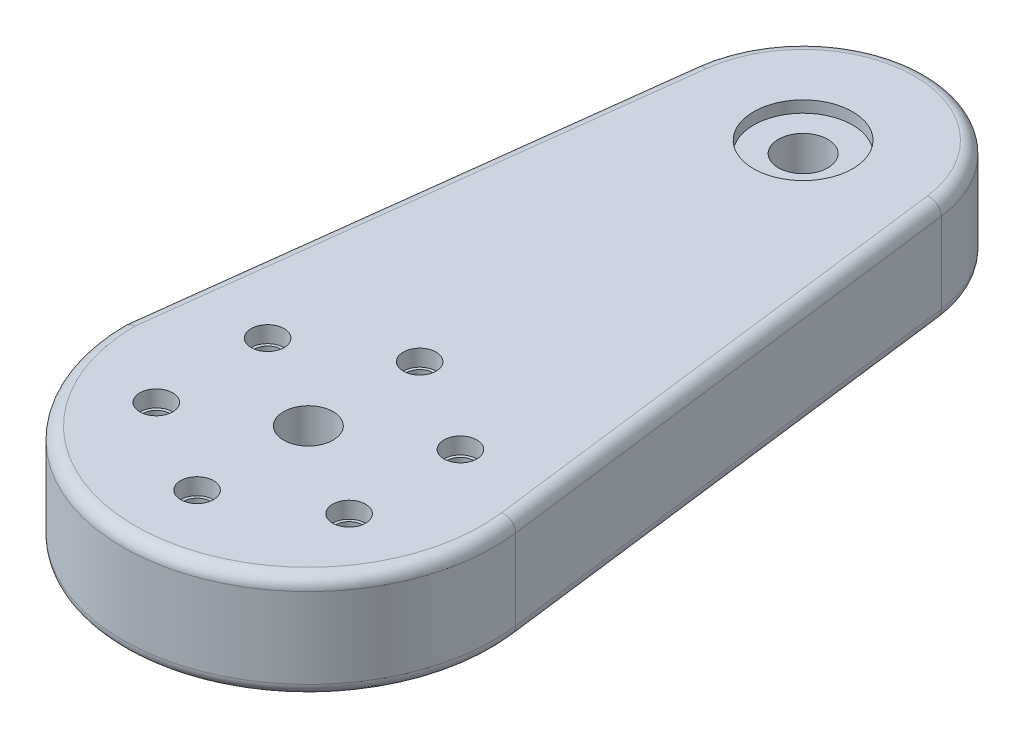
ISO-10303-21;
HEADER;
FILE_DESCRIPTION(('STEP AP214'),'2;1');
FILE_NAME('part.step','',(''),(''),'','','');
FILE_SCHEMA(('AUTOMOTIVE_DESIGN { 1 0 10303 214 1 1 1 1 }'));
ENDSEC;
DATA;
#1=APPLICATION_CONTEXT('core data for automotive mechanical design processes');
#2=APPLICATION_PROTOCOL_DEFINITION('international standard','automotive_design',2000,#1);
#3=PRODUCT_CONTEXT('',#1,'mechanical');
#4=PRODUCT('Part','Part','',(#3));
#5=PRODUCT_RELATED_PRODUCT_CATEGORY('part','',(#4));
#6=PRODUCT_DEFINITION_FORMATION('','',#4);
#7=PRODUCT_DEFINITION_CONTEXT('part definition',#1,'design');
#8=PRODUCT_DEFINITION('design','',#6,#7);
#9=PRODUCT_DEFINITION_SHAPE('','',#8);
#10=(LENGTH_UNIT() NAMED_UNIT(*) SI_UNIT(.MILLI.,.METRE.));
#11=(NAMED_UNIT(*) PLANE_ANGLE_UNIT() SI_UNIT($,.RADIAN.));
#12=(NAMED_UNIT(*) SI_UNIT($,.STERADIAN.) SOLID_ANGLE_UNIT());
#13=UNCERTAINTY_MEASURE_WITH_UNIT(LENGTH_MEASURE(1.E-05),#10,'distance_accuracy_value','');
#14=(GEOMETRIC_REPRESENTATION_CONTEXT(3) GLOBAL_UNCERTAINTY_ASSIGNED_CONTEXT((#13)) GLOBAL_UNIT_ASSIGNED_CONTEXT((#10,
#11,#12)) REPRESENTATION_CONTEXT('',''));
#15=CARTESIAN_POINT('',(0.,0.,0.));
#16=DIRECTION('',(0.,0.,1.));
#17=DIRECTION('',(1.,0.,0.));
#18=AXIS2_PLACEMENT_3D('',#15,#16,#17);
#19=CARTESIAN_POINT('',(-0.0107904248628195,-6.45952704580595,-52.1484733966002));
#20=DIRECTION('',(0.,1.,0.));
#21=DIRECTION('',(0.,0.,1.));
#22=AXIS2_PLACEMENT_3D('',#19,#20,#21);
#23=CYLINDRICAL_SURFACE('',#22,3.);
#24=CARTESIAN_POINT('',(-0.0107904248628195,-6.37500172561487,-52.1484733966002));
#25=DIRECTION('',(0.,1.,0.));
#26=DIRECTION('',(0.,0.,1.));
#27=AXIS2_PLACEMENT_3D('',#24,#25,#26);
#28=CIRCLE('',#27,3.);
#29=CARTESIAN_POINT('',(-0.0107904248628195,-6.37500172561487,-49.1484733966002));
#30=VERTEX_POINT('',#29);
#31=EDGE_CURVE('E151',#30,#30,#28,.T.);
#32=ORIENTED_EDGE('',*,*,#31,.F.);
#33=EDGE_LOOP('',(#32));
#34=FACE_BOUND('',#33,.T.);
#35=CARTESIAN_POINT('',(-0.0107904248628195,4.97499827438514,-52.1484733966002));
#36=DIRECTION('',(0.,1.,0.));
#37=DIRECTION('',(0.,0.,1.));
#38=AXIS2_PLACEMENT_3D('',#35,#36,#37);
#39=CIRCLE('',#38,3.);
#40=CARTESIAN_POINT('',(-0.0107904248628195,4.97499827438514,-49.1484733966002));
#41=VERTEX_POINT('',#40);
#42=EDGE_CURVE('E52',#41,#41,#39,.F.);
#43=ORIENTED_EDGE('',*,*,#42,.F.);
#44=EDGE_LOOP('',(#43));
#45=FACE_BOUND('',#44,.T.);
#46=ADVANCED_FACE('F48',(#34,#45),#23,.F.);
#47=CARTESIAN_POINT('',(22.3127362622447,6.37499827438514,5.03902660339984));
#48=DIRECTION('',(0.992156741649222,0.,-0.125));
#49=DIRECTION('',(-0.125,0.,-0.992156741649222));
#50=AXIS2_PLACEMENT_3D('',#47,#48,#49);
#51=PLANE('',#50);
#52=DIRECTION('',(0.,-1.,0.));
#53=VECTOR('',#52,1.);
#54=CARTESIAN_POINT('',(22.3127362622447,6.37499827438514,5.03902660339983));
#55=LINE('',#54,#53);
#56=CARTESIAN_POINT('',(22.3127362622447,4.87499827438514,5.03902660339983));
#57=VERTEX_POINT('',#56);
#58=CARTESIAN_POINT('',(22.3127362622447,-4.87500172561487,5.03902660339983));
#59=VERTEX_POINT('',#58);
#60=EDGE_CURVE('E142',#57,#59,#55,.T.);
#61=ORIENTED_EDGE('',*,*,#60,.T.);
#62=DIRECTION('',(0.125,0.,0.992156741649222));
#63=VECTOR('',#62,1.);
#64=CARTESIAN_POINT('',(14.8715606998755,-4.87500172561487,-54.0234733966002));
#65=LINE('',#64,#63);
#66=CARTESIAN_POINT('',(14.8715606998755,-4.87500172561487,-54.0234733966002));
#67=VERTEX_POINT('',#66);
#68=EDGE_CURVE('E12',#59,#67,#65,.F.);
#69=ORIENTED_EDGE('',*,*,#68,.T.);
#70=DIRECTION('',(0.,-1.,0.));
#71=VECTOR('',#70,1.);
#72=CARTESIAN_POINT('',(14.8715606998755,6.37499827438514,-54.0234733966002));
#73=LINE('',#72,#71);
#74=CARTESIAN_POINT('',(14.8715606998755,4.87499827438514,-54.0234733966002));
#75=VERTEX_POINT('',#74);
#76=EDGE_CURVE('E136',#75,#67,#73,.T.);
#77=ORIENTED_EDGE('',*,*,#76,.F.);
#78=DIRECTION('',(0.125,0.,0.992156741649222));
#79=VECTOR('',#78,1.);
#80=CARTESIAN_POINT('',(22.3127362622447,4.87499827438514,5.03902660339984));
#81=LINE('',#80,#79);
#82=EDGE_CURVE('E57',#75,#57,#81,.T.);
#83=ORIENTED_EDGE('',*,*,#82,.T.);
#84=EDGE_LOOP('',(#61,#69,#77,#83));
#85=FACE_BOUND('',#84,.T.);
#86=ADVANCED_FACE('F178',(#85),#51,.T.);
#87=CARTESIAN_POINT('',(-0.0107904248628195,6.37499827438514,-52.1484733966002));
#88=DIRECTION('',(0.,-1.,0.));
#89=DIRECTION('',(0.,0.,-1.));
#90=AXIS2_PLACEMENT_3D('',#87,#88,#89);
#91=CYLINDRICAL_SURFACE('',#90,15.);
#92=DIRECTION('',(0.,-1.,0.));
#93=VECTOR('',#92,1.);
#94=CARTESIAN_POINT('',(-14.8983912954131,6.37499827438514,-53.9813237230565));
#95=LINE('',#94,#93);
#96=CARTESIAN_POINT('',(-14.8983912954131,4.87499827438514,-53.9813237230565));
#97=VERTEX_POINT('',#96);
#98=CARTESIAN_POINT('',(-14.8983912954131,-4.87500172561487,-53.9813237230565));
#99=VERTEX_POINT('',#98);
#100=EDGE_CURVE('E249',#97,#99,#95,.T.);
#101=ORIENTED_EDGE('',*,*,#100,.F.);
#102=CARTESIAN_POINT('',(-0.0107904248628195,4.87499827438514,-52.1484733966002));
#103=DIRECTION('',(0.,1.,0.));
#104=DIRECTION('',(0.,0.,1.));
#105=AXIS2_PLACEMENT_3D('',#102,#103,#104);
#106=CIRCLE('',#105,15.);
#107=EDGE_CURVE('E236',#97,#75,#106,.F.);
#108=ORIENTED_EDGE('',*,*,#107,.T.);
#109=ORIENTED_EDGE('',*,*,#76,.T.);
#110=CARTESIAN_POINT('',(-0.0107904248628195,-4.87500172561487,-52.1484733966002));
#111=DIRECTION('',(0.,1.,0.));
#112=DIRECTION('',(0.,0.,1.));
#113=AXIS2_PLACEMENT_3D('',#110,#111,#112);
#114=CIRCLE('',#113,15.);
#115=EDGE_CURVE('E238',#67,#99,#114,.T.);
#116=ORIENTED_EDGE('',*,*,#115,.T.);
#117=EDGE_LOOP('',(#101,#108,#109,#116));
#118=FACE_BOUND('',#117,.T.);
#119=ADVANCED_FACE('F186',(#118),#91,.T.);
#120=CARTESIAN_POINT('',(-22.1748563929437,6.37499827438514,5.12285219182585));
#121=DIRECTION('',(0.992506724703351,0.,0.122190021763756));
#122=DIRECTION('',(0.122190021763756,0.,-0.992506724703351));
#123=AXIS2_PLACEMENT_3D('',#120,#121,#122);
#124=PLANE('',#123);
#125=DIRECTION('',(0.,-1.,0.));
#126=VECTOR('',#125,1.);
#127=CARTESIAN_POINT('',(-22.5107904248628,6.37499827438514,7.85152660339983));
#128=LINE('',#127,#126);
#129=CARTESIAN_POINT('',(-22.5107904248628,4.87499827438514,7.85152660339983));
#130=VERTEX_POINT('',#129);
#131=CARTESIAN_POINT('',(-22.5107904248628,-4.87500172561487,7.85152660339983));
#132=VERTEX_POINT('',#131);
#133=EDGE_CURVE('E252',#130,#132,#128,.T.);
#134=ORIENTED_EDGE('',*,*,#133,.F.);
#135=DIRECTION('',(-0.122190021763756,0.,0.992506724703351));
#136=VECTOR('',#135,1.);
#137=CARTESIAN_POINT('',(-14.8983912954131,4.87499827438514,-53.9813237230565));
#138=LINE('',#137,#136);
#139=EDGE_CURVE('E240',#130,#97,#138,.F.);
#140=ORIENTED_EDGE('',*,*,#139,.T.);
#141=ORIENTED_EDGE('',*,*,#100,.T.);
#142=DIRECTION('',(-0.122190021763756,0.,0.992506724703351));
#143=VECTOR('',#142,1.);
#144=CARTESIAN_POINT('',(-22.1748563929437,-4.87500172561487,5.12285219182585));
#145=LINE('',#144,#143);
#146=EDGE_CURVE('E243',#99,#132,#145,.T.);
#147=ORIENTED_EDGE('',*,*,#146,.T.);
#148=EDGE_LOOP('',(#134,#140,#141,#147));
#149=FACE_BOUND('',#148,.T.);
#150=ADVANCED_FACE('F204',(#149),#124,.F.);
#151=CARTESIAN_POINT('',(-0.0107904248628195,6.37499827438514,7.85152660339983));
#152=DIRECTION('',(0.,-1.,0.));
#153=DIRECTION('',(0.,0.,-1.));
#154=AXIS2_PLACEMENT_3D('',#151,#152,#153);
#155=CYLINDRICAL_SURFACE('',#154,22.5);
#156=ORIENTED_EDGE('',*,*,#60,.F.);
#157=CARTESIAN_POINT('',(-0.0107904248628195,4.87499827438514,7.85152660339983));
#158=DIRECTION('',(0.,1.,0.));
#159=DIRECTION('',(0.,0.,1.));
#160=AXIS2_PLACEMENT_3D('',#157,#158,#159);
#161=CIRCLE('',#160,22.5);
#162=EDGE_CURVE('E139',#57,#130,#161,.F.);
#163=ORIENTED_EDGE('',*,*,#162,.T.);
#164=ORIENTED_EDGE('',*,*,#133,.T.);
#165=CARTESIAN_POINT('',(-0.0107904248628195,-4.87500172561487,7.85152660339983));
#166=DIRECTION('',(0.,1.,0.));
#167=DIRECTION('',(0.,0.,1.));
#168=AXIS2_PLACEMENT_3D('',#165,#166,#167);
#169=CIRCLE('',#168,22.5);
#170=EDGE_CURVE('E233',#132,#59,#169,.T.);
#171=ORIENTED_EDGE('',*,*,#170,.T.);
#172=EDGE_LOOP('',(#156,#163,#164,#171));
#173=FACE_BOUND('',#172,.T.);
#174=ADVANCED_FACE('F197',(#173),#155,.T.);
#175=CARTESIAN_POINT('',(-0.0107904248628195,6.37499827438514,7.85152660339983));
#176=DIRECTION('',(0.,1.,0.));
#177=DIRECTION('',(0.,0.,1.));
#178=AXIS2_PLACEMENT_3D('',#175,#176,#177);
#179=PLANE('',#178);
#180=CARTESIAN_POINT('',(-0.0107904248628195,6.37499827438514,-52.1484733966002));
#181=DIRECTION('',(0.,1.,0.));
#182=DIRECTION('',(0.,0.,1.));
#183=AXIS2_PLACEMENT_3D('',#180,#181,#182);
#184=CIRCLE('',#183,6.);
#185=CARTESIAN_POINT('',(-0.0107904248628195,6.37499827438514,-46.1484733966002));
#186=VERTEX_POINT('',#185);
#187=EDGE_CURVE('E335',#186,#186,#184,.T.);
#188=ORIENTED_EDGE('',*,*,#187,.F.);
#189=EDGE_LOOP('',(#188));
#190=FACE_BOUND('',#189,.T.);
#191=CARTESIAN_POINT('',(11.680552526227,6.37499827438514,1.1015266033997));
#192=DIRECTION('',(0.,1.,0.));
#193=DIRECTION('',(-0.866025403784433,0.,0.50000000000001));
#194=AXIS2_PLACEMENT_3D('',#191,#192,#193);
#195=CIRCLE('',#194,2.);
#196=CARTESIAN_POINT('',(9.94850171865816,6.37499827438514,2.10152660339972));
#197=VERTEX_POINT('',#196);
#198=EDGE_CURVE('E270',#197,#197,#195,.T.);
#199=ORIENTED_EDGE('',*,*,#198,.F.);
#200=EDGE_LOOP('',(#199));
#201=FACE_BOUND('',#200,.T.);
#202=CARTESIAN_POINT('',(11.6805525262272,6.37499827438514,14.6015266033997));
#203=DIRECTION('',(0.,1.,0.));
#204=DIRECTION('',(-0.866025403784443,0.,-0.499999999999992));
#205=AXIS2_PLACEMENT_3D('',#202,#203,#204);
#206=CIRCLE('',#205,2.);
#207=CARTESIAN_POINT('',(9.94850171865828,6.37499827438514,13.6015266033997));
#208=VERTEX_POINT('',#207);
#209=EDGE_CURVE('E277',#208,#208,#206,.T.);
#210=ORIENTED_EDGE('',*,*,#209,.F.);
#211=EDGE_LOOP('',(#210));
#212=FACE_BOUND('',#211,.T.);
#213=CARTESIAN_POINT('',(-0.0107904248628195,6.37499827438514,21.3515266033998));
#214=DIRECTION('',(0.,1.,0.));
#215=DIRECTION('',(0.,0.,-1.));
#216=AXIS2_PLACEMENT_3D('',#213,#214,#215);
#217=CIRCLE('',#216,2.);
#218=CARTESIAN_POINT('',(-0.0107904248628195,6.37499827438514,19.3515266033998));
#219=VERTEX_POINT('',#218);
#220=EDGE_CURVE('E283',#219,#219,#217,.T.);
#221=ORIENTED_EDGE('',*,*,#220,.F.);
#222=EDGE_LOOP('',(#221));
#223=FACE_BOUND('',#222,.T.);
#224=CARTESIAN_POINT('',(-11.7021333759527,6.37499827438514,14.6015266033999));
#225=DIRECTION('',(0.,1.,0.));
#226=DIRECTION('',(0.866025403784436,0.,-0.500000000000004));
#227=AXIS2_PLACEMENT_3D('',#224,#225,#226);
#228=CIRCLE('',#227,2.);
#229=CARTESIAN_POINT('',(-9.97008256838384,6.37499827438514,13.6015266033999));
#230=VERTEX_POINT('',#229);
#231=EDGE_CURVE('E289',#230,#230,#228,.T.);
#232=ORIENTED_EDGE('',*,*,#231,.F.);
#233=EDGE_LOOP('',(#232));
#234=FACE_BOUND('',#233,.T.);
#235=CARTESIAN_POINT('',(-11.7021333759528,6.37499827438514,1.10152660339986));
#236=DIRECTION('',(0.,1.,0.));
#237=DIRECTION('',(0.86602540378444,0.,0.499999999999998));
#238=AXIS2_PLACEMENT_3D('',#235,#236,#237);
#239=CIRCLE('',#238,2.);
#240=CARTESIAN_POINT('',(-9.97008256838388,6.37499827438514,2.10152660339986));
#241=VERTEX_POINT('',#240);
#242=EDGE_CURVE('E264',#241,#241,#239,.T.);
#243=ORIENTED_EDGE('',*,*,#242,.F.);
#244=EDGE_LOOP('',(#243));
#245=FACE_BOUND('',#244,.T.);
#246=CARTESIAN_POINT('',(-0.0107904248628195,6.37499827438514,-5.64847339660017));
#247=DIRECTION('',(0.,1.,0.));
#248=DIRECTION('',(0.,0.,1.));
#249=AXIS2_PLACEMENT_3D('',#246,#247,#248);
#250=CIRCLE('',#249,2.);
#251=CARTESIAN_POINT('',(-0.0107904248628195,6.37499827438514,-3.64847339660017));
#252=VERTEX_POINT('',#251);
#253=EDGE_CURVE('E257',#252,#252,#250,.T.);
#254=ORIENTED_EDGE('',*,*,#253,.F.);
#255=EDGE_LOOP('',(#254));
#256=FACE_BOUND('',#255,.T.);
#257=CARTESIAN_POINT('',(-0.0107904248628195,6.37499827438514,-52.1484733966002));
#258=DIRECTION('',(0.,1.,0.));
#259=DIRECTION('',(0.,0.,1.));
#260=AXIS2_PLACEMENT_3D('',#257,#258,#259);
#261=CIRCLE('',#260,13.5);
#262=CARTESIAN_POINT('',(13.3833255874017,6.37499827438514,-53.8359733966002));
#263=VERTEX_POINT('',#262);
#264=CARTESIAN_POINT('',(-13.4096312083581,6.37499827438514,-53.7980386904109));
#265=VERTEX_POINT('',#264);
#266=EDGE_CURVE('E125',#263,#265,#261,.T.);
#267=ORIENTED_EDGE('',*,*,#266,.T.);
#268=DIRECTION('',(-0.122190021763756,0.,0.992506724703351));
#269=VECTOR('',#268,1.);
#270=CARTESIAN_POINT('',(-21.0220303378078,6.37499827438514,8.03481163604547));
#271=LINE('',#270,#269);
#272=CARTESIAN_POINT('',(-21.0105958209166,6.37499827438514,7.94193306262037));
#273=VERTEX_POINT('',#272);
#274=EDGE_CURVE('E121',#265,#273,#271,.T.);
#275=ORIENTED_EDGE('',*,*,#274,.T.);
#276=CARTESIAN_POINT('',(-0.0107904248628195,6.37499827438514,7.85152660339983));
#277=DIRECTION('',(0.,1.,0.));
#278=DIRECTION('',(0.,0.,1.));
#279=AXIS2_PLACEMENT_3D('',#276,#277,#278);
#280=CIRCLE('',#279,21.);
#281=CARTESIAN_POINT('',(20.8245011497708,6.37499827438514,5.22652660339983));
#282=VERTEX_POINT('',#281);
#283=EDGE_CURVE('E114',#273,#282,#280,.T.);
#284=ORIENTED_EDGE('',*,*,#283,.T.);
#285=DIRECTION('',(0.125,0.,0.992156741649222));
#286=VECTOR('',#285,1.);
#287=CARTESIAN_POINT('',(20.8245011497708,6.37499827438514,5.22652660339984));
#288=LINE('',#287,#286);
#289=EDGE_CURVE('E118',#282,#263,#288,.F.);
#290=ORIENTED_EDGE('',*,*,#289,.T.);
#291=EDGE_LOOP('',(#267,#275,#284,#290));
#292=FACE_BOUND('',#291,.T.);
#293=CARTESIAN_POINT('',(-0.0107904248628195,6.37499827438514,7.85152660339983));
#294=DIRECTION('',(0.,1.,0.));
#295=DIRECTION('',(0.,0.,1.));
#296=AXIS2_PLACEMENT_3D('',#293,#294,#295);
#297=CIRCLE('',#296,3.);
#298=CARTESIAN_POINT('',(-0.0107904248628195,6.37499827438514,10.8515266033998));
#299=VERTEX_POINT('',#298);
#300=EDGE_CURVE('E332',#299,#299,#297,.T.);
#301=ORIENTED_EDGE('',*,*,#300,.F.);
#302=EDGE_LOOP('',(#301));
#303=FACE_BOUND('',#302,.T.);
#304=ADVANCED_FACE('F116',(#190,#201,#212,#223,#234,#245,#256,#292,#303),#179,.T.);
#305=CARTESIAN_POINT('',(-0.0107904248628195,-6.37500172561487,7.85152660339983));
#306=DIRECTION('',(0.,1.,0.));
#307=DIRECTION('',(0.,0.,1.));
#308=AXIS2_PLACEMENT_3D('',#305,#306,#307);
#309=PLANE('',#308);
#310=ORIENTED_EDGE('',*,*,#31,.T.);
#311=EDGE_LOOP('',(#310));
#312=FACE_BOUND('',#311,.T.);
#313=DIRECTION('',(0.125,0.,0.992156741649222));
#314=VECTOR('',#313,1.);
#315=CARTESIAN_POINT('',(20.8245011497708,-6.37500172561487,5.22652660339983));
#316=LINE('',#315,#314);
#317=CARTESIAN_POINT('',(13.3833255874017,-6.37500172561487,-53.8359733966002));
#318=VERTEX_POINT('',#317);
#319=CARTESIAN_POINT('',(20.8245011497708,-6.37500172561487,5.22652660339983));
#320=VERTEX_POINT('',#319);
#321=EDGE_CURVE('E65',#318,#320,#316,.T.);
#322=ORIENTED_EDGE('',*,*,#321,.T.);
#323=CARTESIAN_POINT('',(-0.0107904248628195,-6.37500172561487,7.85152660339983));
#324=DIRECTION('',(0.,1.,0.));
#325=DIRECTION('',(0.,0.,1.));
#326=AXIS2_PLACEMENT_3D('',#323,#324,#325);
#327=CIRCLE('',#326,21.);
#328=CARTESIAN_POINT('',(-21.0105958209166,-6.37500172561487,7.94193306262038));
#329=VERTEX_POINT('',#328);
#330=EDGE_CURVE('E226',#320,#329,#327,.F.);
#331=ORIENTED_EDGE('',*,*,#330,.T.);
#332=DIRECTION('',(-0.122190021763756,0.,0.992506724703351));
#333=VECTOR('',#332,1.);
#334=CARTESIAN_POINT('',(-20.6860963058887,-6.37500172561487,5.30613722447149));
#335=LINE('',#334,#333);
#336=CARTESIAN_POINT('',(-13.4096312083581,-6.37500172561487,-53.7980386904109));
#337=VERTEX_POINT('',#336);
#338=EDGE_CURVE('E230',#329,#337,#335,.F.);
#339=ORIENTED_EDGE('',*,*,#338,.T.);
#340=CARTESIAN_POINT('',(-0.0107904248628195,-6.37500172561487,-52.1484733966002));
#341=DIRECTION('',(0.,1.,0.));
#342=DIRECTION('',(0.,0.,1.));
#343=AXIS2_PLACEMENT_3D('',#340,#341,#342);
#344=CIRCLE('',#343,13.5);
#345=EDGE_CURVE('E70',#337,#318,#344,.F.);
#346=ORIENTED_EDGE('',*,*,#345,.T.);
#347=EDGE_LOOP('',(#322,#331,#339,#346));
#348=FACE_BOUND('',#347,.T.);
#349=CARTESIAN_POINT('',(-0.0107904248628195,-6.37500172561487,7.85152660339983));
#350=DIRECTION('',(0.,1.,0.));
#351=DIRECTION('',(0.,0.,1.));
#352=AXIS2_PLACEMENT_3D('',#349,#350,#351);
#353=CIRCLE('',#352,3.);
#354=CARTESIAN_POINT('',(-0.0107904248628195,-6.37500172561487,10.8515266033998));
#355=VERTEX_POINT('',#354);
#356=EDGE_CURVE('E310',#355,#355,#353,.F.);
#357=ORIENTED_EDGE('',*,*,#356,.F.);
#358=EDGE_LOOP('',(#357));
#359=FACE_BOUND('',#358,.T.);
#360=ADVANCED_FACE('F196',(#312,#348,#359),#309,.F.);
#361=CARTESIAN_POINT('',(20.8245011497708,4.87499827438514,5.22652660339984));
#362=DIRECTION('',(0.125,0.,0.992156741649222));
#363=DIRECTION('',(0.992156741649222,0.,-0.125));
#364=AXIS2_PLACEMENT_3D('',#361,#362,#363);
#365=CYLINDRICAL_SURFACE('',#364,1.5);
#366=CARTESIAN_POINT('',(20.8245011497708,4.87499827438514,5.22652660339983));
#367=DIRECTION('',(0.125,0.,0.992156741649221));
#368=DIRECTION('',(0.992156741649222,0.,-0.125));
#369=AXIS2_PLACEMENT_3D('',#366,#367,#368);
#370=CIRCLE('',#369,1.5);
#371=EDGE_CURVE('E131',#57,#282,#370,.T.);
#372=ORIENTED_EDGE('',*,*,#371,.F.);
#373=ORIENTED_EDGE('',*,*,#82,.F.);
#374=CARTESIAN_POINT('',(13.3833255874017,4.87499827438514,-53.8359733966002));
#375=DIRECTION('',(-0.125,0.,-0.992156741649221));
#376=DIRECTION('',(-0.992156741649222,0.,0.125));
#377=AXIS2_PLACEMENT_3D('',#374,#375,#376);
#378=CIRCLE('',#377,1.5);
#379=EDGE_CURVE('E134',#263,#75,#378,.T.);
#380=ORIENTED_EDGE('',*,*,#379,.F.);
#381=ORIENTED_EDGE('',*,*,#289,.F.);
#382=EDGE_LOOP('',(#372,#373,#380,#381));
#383=FACE_BOUND('',#382,.T.);
#384=ADVANCED_FACE('F129',(#383),#365,.T.);
#385=CARTESIAN_POINT('',(-0.0107904248628195,4.87499827438514,-52.1484733966002));
#386=DIRECTION('',(0.,1.,0.));
#387=DIRECTION('',(0.,0.,1.));
#388=AXIS2_PLACEMENT_3D('',#385,#386,#387);
#389=TOROIDAL_SURFACE('',#388,13.5,1.5);
#390=ORIENTED_EDGE('',*,*,#379,.T.);
#391=ORIENTED_EDGE('',*,*,#107,.F.);
#392=CARTESIAN_POINT('',(-13.4096312083581,4.87499827438514,-53.7980386904109));
#393=DIRECTION('',(-0.122190021763758,0.,0.99250672470335));
#394=DIRECTION('',(0.99250672470335,0.,0.122190021763758));
#395=AXIS2_PLACEMENT_3D('',#392,#393,#394);
#396=CIRCLE('',#395,1.5);
#397=EDGE_CURVE('E140',#265,#97,#396,.T.);
#398=ORIENTED_EDGE('',*,*,#397,.F.);
#399=ORIENTED_EDGE('',*,*,#266,.F.);
#400=EDGE_LOOP('',(#390,#391,#398,#399));
#401=FACE_BOUND('',#400,.T.);
#402=ADVANCED_FACE('F666',(#401),#389,.T.);
#403=CARTESIAN_POINT('',(-0.0107904248628195,4.87499827438514,7.85152660339983));
#404=DIRECTION('',(0.,1.,0.));
#405=DIRECTION('',(0.,0.,1.));
#406=AXIS2_PLACEMENT_3D('',#403,#404,#405);
#407=TOROIDAL_SURFACE('',#406,21.,1.5);
#408=ORIENTED_EDGE('',*,*,#371,.T.);
#409=ORIENTED_EDGE('',*,*,#283,.F.);
#410=CARTESIAN_POINT('',(-22.5107904248628,4.87499827438514,7.85152660339983));
#411=CARTESIAN_POINT('',(-22.5107901829935,4.91714087708028,7.85152659723021));
#412=CARTESIAN_POINT('',(-22.5090133079756,4.959263269696,7.85163558700152));
#413=CARTESIAN_POINT('',(-22.5019248942275,5.04320622951296,7.8520702389999));
#414=CARTESIAN_POINT('',(-22.4966135374248,5.08502681213703,7.85239589007493));
#415=CARTESIAN_POINT('',(-22.4754284605339,5.2095146139862,7.85369445785774));
#416=CARTESIAN_POINT('',(-22.4543035935051,5.29134722199653,7.85498899883345));
#417=CARTESIAN_POINT('',(-22.3986434276262,5.4502938561059,7.85839589610339));
#418=CARTESIAN_POINT('',(-22.3641019701996,5.52740569640076,7.86050862796795));
#419=CARTESIAN_POINT('',(-22.2826026261328,5.67472526689802,7.86548552098579));
#420=CARTESIAN_POINT('',(-22.2356475131756,5.74493453459622,7.86834951427756));
#421=CARTESIAN_POINT('',(-22.1306183260941,5.87652335295609,7.87474280472704));
#422=CARTESIAN_POINT('',(-22.0725358187479,5.93789614444525,7.8782726064557));
#423=CARTESIAN_POINT('',(-21.9469030692277,6.05004448094101,7.88588942378067));
#424=CARTESIAN_POINT('',(-21.8793495666353,6.10081636150551,7.88997663125232));
#425=CARTESIAN_POINT('',(-21.7365716235041,6.19040262367989,7.89859191163057));
#426=CARTESIAN_POINT('',(-21.6613316142432,6.22919206972302,7.90312087843038));
#427=CARTESIAN_POINT('',(-21.5054559887271,6.29355857888962,7.9124758291744));
#428=CARTESIAN_POINT('',(-21.4248252432311,6.31914739186985,7.91730154468548));
#429=CARTESIAN_POINT('',(-21.2925443702084,6.34917470420195,7.92519374427769));
#430=CARTESIAN_POINT('',(-21.2418341772514,6.35796899862915,7.92821361193026));
#431=CARTESIAN_POINT('',(-21.1398295273477,6.37030292126336,7.93427634090938));
#432=CARTESIAN_POINT('',(-21.0885360670359,6.37385045525799,7.93731916068336));
#433=CARTESIAN_POINT('',(-21.028349555999,6.37491968269295,7.94088249486274));
#434=CARTESIAN_POINT('',(-21.0194721175099,6.37499848364864,7.94140790288401));
#435=CARTESIAN_POINT('',(-21.0105958209166,6.37499827438514,7.94193306262035));
#436=B_SPLINE_CURVE_WITH_KNOTS('',3,(#410,#411,#412,#413,#414,#415,#416,#417,#418,#419,#420,
#421,#422,#423,#424,#425,#426,#427,#428,#429,#430,#431,#432,#433,#434,#435),.UNSPECIFIED.,.F.,
.F.,(4,2,2,2,2,2,2,2,2,2,2,2,4),(0.,0.126350086341622,0.25269366967037,0.504968156682656,
0.757358581591167,1.00969266046606,1.26221874011159,1.5148319670581,1.76796739732631,
2.02087712180187,2.17531309731499,2.32951613169076,2.35619447044034),.UNSPECIFIED.);
#437=EDGE_CURVE('E144',#130,#273,#436,.T.);
#438=ORIENTED_EDGE('',*,*,#437,.F.);
#439=ORIENTED_EDGE('',*,*,#162,.F.);
#440=EDGE_LOOP('',(#408,#409,#438,#439));
#441=FACE_BOUND('',#440,.T.);
#442=ADVANCED_FACE('F138',(#441),#407,.T.);
#443=CARTESIAN_POINT('',(-20.6860963058887,4.87499827438514,5.30613722447149));
#444=DIRECTION('',(0.122190021763756,0.,-0.992506724703351));
#445=DIRECTION('',(-0.992506724703351,0.,-0.122190021763756));
#446=AXIS2_PLACEMENT_3D('',#443,#444,#445);
#447=CYLINDRICAL_SURFACE('',#446,1.5);
#448=ORIENTED_EDGE('',*,*,#397,.T.);
#449=ORIENTED_EDGE('',*,*,#139,.F.);
#450=ORIENTED_EDGE('',*,*,#437,.T.);
#451=ORIENTED_EDGE('',*,*,#274,.F.);
#452=EDGE_LOOP('',(#448,#449,#450,#451));
#453=FACE_BOUND('',#452,.T.);
#454=ADVANCED_FACE('F212',(#453),#447,.T.);
#455=CARTESIAN_POINT('',(-0.0107904248628195,-4.87500172561487,-52.1484733966002));
#456=DIRECTION('',(0.,1.,0.));
#457=DIRECTION('',(0.,0.,1.));
#458=AXIS2_PLACEMENT_3D('',#455,#456,#457);
#459=TOROIDAL_SURFACE('',#458,13.5,1.5);
#460=CARTESIAN_POINT('',(13.3833255874017,-4.87500172561487,-53.8359733966002));
#461=DIRECTION('',(0.125,0.,0.992156741649222));
#462=DIRECTION('',(0.992156741649222,0.,-0.125));
#463=AXIS2_PLACEMENT_3D('',#460,#461,#462);
#464=CIRCLE('',#463,1.5);
#465=EDGE_CURVE('E159',#318,#67,#464,.T.);
#466=ORIENTED_EDGE('',*,*,#465,.F.);
#467=ORIENTED_EDGE('',*,*,#345,.F.);
#468=CARTESIAN_POINT('',(-13.4096312083581,-4.87500172561487,-53.7980386904109));
#469=DIRECTION('',(-0.122190021763759,0.,0.99250672470335));
#470=DIRECTION('',(0.99250672470335,0.,0.122190021763759));
#471=AXIS2_PLACEMENT_3D('',#468,#469,#470);
#472=CIRCLE('',#471,1.5);
#473=EDGE_CURVE('E223',#99,#337,#472,.T.);
#474=ORIENTED_EDGE('',*,*,#473,.F.);
#475=ORIENTED_EDGE('',*,*,#115,.F.);
#476=EDGE_LOOP('',(#466,#467,#474,#475));
#477=FACE_BOUND('',#476,.T.);
#478=ADVANCED_FACE('F50',(#477),#459,.T.);
#479=CARTESIAN_POINT('',(-20.6860963058887,-4.87500172561487,5.30613722447149));
#480=DIRECTION('',(-0.122190021763756,0.,0.992506724703351));
#481=DIRECTION('',(0.992506724703351,0.,0.122190021763756));
#482=AXIS2_PLACEMENT_3D('',#479,#480,#481);
#483=CYLINDRICAL_SURFACE('',#482,1.5);
#484=ORIENTED_EDGE('',*,*,#473,.T.);
#485=ORIENTED_EDGE('',*,*,#338,.F.);
#486=CARTESIAN_POINT('',(-22.5107904248628,-4.87500172561487,7.85152660339983));
#487=CARTESIAN_POINT('',(-22.5107901829935,-4.91714432831001,7.85152659723021));
#488=CARTESIAN_POINT('',(-22.5090133079756,-4.95926672092573,7.85163558700152));
#489=CARTESIAN_POINT('',(-22.5019248942275,-5.04320968074269,7.8520702389999));
#490=CARTESIAN_POINT('',(-22.4966135374248,-5.08503026336676,7.85239589007493));
#491=CARTESIAN_POINT('',(-22.4754284605339,-5.20951806521593,7.85369445785774));
#492=CARTESIAN_POINT('',(-22.4543035935051,-5.29135067322625,7.85498899883345));
#493=CARTESIAN_POINT('',(-22.3986434276262,-5.45029730733563,7.85839589610339));
#494=CARTESIAN_POINT('',(-22.3641019701996,-5.52740914763049,7.86050862796795));
#495=CARTESIAN_POINT('',(-22.2826026261328,-5.67472871812775,7.86548552098579));
#496=CARTESIAN_POINT('',(-22.2356475131756,-5.74493798582594,7.86834951427756));
#497=CARTESIAN_POINT('',(-22.1306183260941,-5.87652680418582,7.87474280472704));
#498=CARTESIAN_POINT('',(-22.0725358187479,-5.93789959567498,7.8782726064557));
#499=CARTESIAN_POINT('',(-21.9469030692277,-6.05004793217074,7.88588942378067));
#500=CARTESIAN_POINT('',(-21.8793495666353,-6.10081981273524,7.88997663125232));
#501=CARTESIAN_POINT('',(-21.7365716235041,-6.19040607490962,7.89859191163057));
#502=CARTESIAN_POINT('',(-21.6613316142432,-6.22919552095275,7.90312087843038));
#503=CARTESIAN_POINT('',(-21.5054559887271,-6.29356203011935,7.9124758291744));
#504=CARTESIAN_POINT('',(-21.4248252432311,-6.31915084309958,7.91730154468548));
#505=CARTESIAN_POINT('',(-21.2925443702084,-6.34917815543168,7.92519374427769));
#506=CARTESIAN_POINT('',(-21.2418341772514,-6.35797244985888,7.92821361193026));
#507=CARTESIAN_POINT('',(-21.1398295273477,-6.37030637249309,7.93427634090938));
#508=CARTESIAN_POINT('',(-21.0885360670359,-6.37385390648772,7.93731916068336));
#509=CARTESIAN_POINT('',(-21.028349555999,-6.37492313392268,7.94088249486274));
#510=CARTESIAN_POINT('',(-21.0194721175099,-6.37500193487837,7.94140790288401));
#511=CARTESIAN_POINT('',(-21.0105958209166,-6.37500172561487,7.94193306262035));
#512=B_SPLINE_CURVE_WITH_KNOTS('',3,(#486,#487,#488,#489,#490,#491,#492,#493,#494,#495,#496,
#497,#498,#499,#500,#501,#502,#503,#504,#505,#506,#507,#508,#509,#510,#511),.UNSPECIFIED.,.F.,
.F.,(4,2,2,2,2,2,2,2,2,2,2,2,4),(0.,0.126350086341622,0.25269366967037,0.504968156682656,
0.757358581591167,1.00969266046606,1.26221874011159,1.5148319670581,1.76796739732631,
2.02087712180187,2.17531309731499,2.32951613169076,2.35619447044034),.UNSPECIFIED.);
#513=EDGE_CURVE('E150',#132,#329,#512,.T.);
#514=ORIENTED_EDGE('',*,*,#513,.F.);
#515=ORIENTED_EDGE('',*,*,#146,.F.);
#516=EDGE_LOOP('',(#484,#485,#514,#515));
#517=FACE_BOUND('',#516,.T.);
#518=ADVANCED_FACE('F164',(#517),#483,.T.);
#519=CARTESIAN_POINT('',(20.8245011497708,-4.87500172561487,5.22652660339984));
#520=DIRECTION('',(-0.125,0.,-0.992156741649222));
#521=DIRECTION('',(-0.992156741649222,0.,0.125));
#522=AXIS2_PLACEMENT_3D('',#519,#520,#521);
#523=CYLINDRICAL_SURFACE('',#522,1.5);
#524=ORIENTED_EDGE('',*,*,#465,.T.);
#525=ORIENTED_EDGE('',*,*,#68,.F.);
#526=CARTESIAN_POINT('',(20.8245011497708,-4.87500172561487,5.22652660339983));
#527=DIRECTION('',(0.125,0.,0.992156741649222));
#528=DIRECTION('',(0.992156741649222,0.,-0.125));
#529=AXIS2_PLACEMENT_3D('',#526,#527,#528);
#530=CIRCLE('',#529,1.5);
#531=EDGE_CURVE('E148',#320,#59,#530,.T.);
#532=ORIENTED_EDGE('',*,*,#531,.F.);
#533=ORIENTED_EDGE('',*,*,#321,.F.);
#534=EDGE_LOOP('',(#524,#525,#532,#533));
#535=FACE_BOUND('',#534,.T.);
#536=ADVANCED_FACE('F167',(#535),#523,.T.);
#537=CARTESIAN_POINT('',(-0.0107904248628195,-4.87500172561487,7.85152660339983));
#538=DIRECTION('',(0.,1.,0.));
#539=DIRECTION('',(0.,0.,1.));
#540=AXIS2_PLACEMENT_3D('',#537,#538,#539);
#541=TOROIDAL_SURFACE('',#540,21.,1.5);
#542=ORIENTED_EDGE('',*,*,#513,.T.);
#543=ORIENTED_EDGE('',*,*,#330,.F.);
#544=ORIENTED_EDGE('',*,*,#531,.T.);
#545=ORIENTED_EDGE('',*,*,#170,.F.);
#546=EDGE_LOOP('',(#542,#543,#544,#545));
#547=FACE_BOUND('',#546,.T.);
#548=ADVANCED_FACE('F161',(#547),#541,.T.);
#549=CARTESIAN_POINT('',(-0.0107904248628195,4.37499827438514,-5.64847339660017));
#550=DIRECTION('',(0.,1.,0.));
#551=DIRECTION('',(0.,0.,1.));
#552=AXIS2_PLACEMENT_3D('',#549,#550,#551);
#553=PLANE('',#552);
#554=CARTESIAN_POINT('',(-0.0107904248628195,4.37499827438514,-5.64847339660017));
#555=DIRECTION('',(0.,1.,0.));
#556=DIRECTION('',(0.,0.,1.));
#557=AXIS2_PLACEMENT_3D('',#554,#555,#556);
#558=CIRCLE('',#557,1.65);
#559=CARTESIAN_POINT('',(-0.0107904248628195,4.37499827438514,-3.99847339660017));
#560=VERTEX_POINT('',#559);
#561=EDGE_CURVE('E294',#560,#560,#558,.T.);
#562=ORIENTED_EDGE('',*,*,#561,.F.);
#563=EDGE_LOOP('',(#562));
#564=FACE_BOUND('',#563,.T.);
#565=CARTESIAN_POINT('',(-0.0107904248628195,4.37499827438514,-5.64847339660017));
#566=DIRECTION('',(0.,1.,0.));
#567=DIRECTION('',(0.,0.,1.));
#568=AXIS2_PLACEMENT_3D('',#565,#566,#567);
#569=CIRCLE('',#568,2.);
#570=CARTESIAN_POINT('',(-0.0107904248628195,4.37499827438514,-3.64847339660017));
#571=VERTEX_POINT('',#570);
#572=EDGE_CURVE('E260',#571,#571,#569,.T.);
#573=ORIENTED_EDGE('',*,*,#572,.T.);
#574=EDGE_LOOP('',(#573));
#575=FACE_BOUND('',#574,.T.);
#576=ADVANCED_FACE('F174',(#564,#575),#553,.T.);
#577=CARTESIAN_POINT('',(-0.0107904248628195,4.37499827438514,-5.64847339660017));
#578=DIRECTION('',(0.,1.,0.));
#579=DIRECTION('',(0.,0.,1.));
#580=AXIS2_PLACEMENT_3D('',#577,#578,#579);
#581=CYLINDRICAL_SURFACE('',#580,2.);
#582=ORIENTED_EDGE('',*,*,#572,.F.);
#583=EDGE_LOOP('',(#582));
#584=FACE_BOUND('',#583,.T.);
#585=ORIENTED_EDGE('',*,*,#253,.T.);
#586=EDGE_LOOP('',(#585));
#587=FACE_BOUND('',#586,.T.);
#588=ADVANCED_FACE('F193',(#584,#587),#581,.F.);
#589=CARTESIAN_POINT('',(11.680552526227,4.37499827438514,1.1015266033997));
#590=DIRECTION('',(0.,1.,0.));
#591=DIRECTION('',(-0.866025403784433,0.,0.50000000000001));
#592=AXIS2_PLACEMENT_3D('',#589,#590,#591);
#593=PLANE('',#592);
#594=CARTESIAN_POINT('',(11.6805525262271,4.37499827438514,1.10152660339986));
#595=DIRECTION('',(0.,1.,0.));
#596=DIRECTION('',(-0.86602540378444,0.,0.499999999999998));
#597=AXIS2_PLACEMENT_3D('',#594,#595,#596);
#598=CIRCLE('',#597,1.65);
#599=CARTESIAN_POINT('',(10.2516106099828,4.37499827438514,1.92652660339986));
#600=VERTEX_POINT('',#599);
#601=EDGE_CURVE('E300',#600,#600,#598,.T.);
#602=ORIENTED_EDGE('',*,*,#601,.F.);
#603=EDGE_LOOP('',(#602));
#604=FACE_BOUND('',#603,.T.);
#605=CARTESIAN_POINT('',(11.680552526227,4.37499827438514,1.1015266033997));
#606=DIRECTION('',(0.,1.,0.));
#607=DIRECTION('',(-0.866025403784433,0.,0.50000000000001));
#608=AXIS2_PLACEMENT_3D('',#605,#606,#607);
#609=CIRCLE('',#608,2.);
#610=CARTESIAN_POINT('',(9.94850171865816,4.37499827438514,2.10152660339972));
#611=VERTEX_POINT('',#610);
#612=EDGE_CURVE('E273',#611,#611,#609,.T.);
#613=ORIENTED_EDGE('',*,*,#612,.T.);
#614=EDGE_LOOP('',(#613));
#615=FACE_BOUND('',#614,.T.);
#616=ADVANCED_FACE('F433',(#604,#615),#593,.T.);
#617=CARTESIAN_POINT('',(11.680552526227,4.37499827438514,1.1015266033997));
#618=DIRECTION('',(0.,1.,0.));
#619=DIRECTION('',(0.,0.,1.));
#620=AXIS2_PLACEMENT_3D('',#617,#618,#619);
#621=CYLINDRICAL_SURFACE('',#620,2.);
#622=ORIENTED_EDGE('',*,*,#612,.F.);
#623=EDGE_LOOP('',(#622));
#624=FACE_BOUND('',#623,.T.);
#625=ORIENTED_EDGE('',*,*,#198,.T.);
#626=EDGE_LOOP('',(#625));
#627=FACE_BOUND('',#626,.T.);
#628=ADVANCED_FACE('F428',(#624,#627),#621,.F.);
#629=CARTESIAN_POINT('',(11.6805525262272,4.37499827438514,14.6015266033997));
#630=DIRECTION('',(0.,1.,0.));
#631=DIRECTION('',(-0.866025403784443,0.,-0.499999999999992));
#632=AXIS2_PLACEMENT_3D('',#629,#630,#631);
#633=PLANE('',#632);
#634=CARTESIAN_POINT('',(11.6805525262271,4.37499827438514,14.6015266033999));
#635=DIRECTION('',(0.,1.,0.));
#636=DIRECTION('',(-0.866025403784436,0.,-0.500000000000004));
#637=AXIS2_PLACEMENT_3D('',#634,#635,#636);
#638=CIRCLE('',#637,1.65);
#639=CARTESIAN_POINT('',(10.2516106099828,4.37499827438514,13.7765266033999));
#640=VERTEX_POINT('',#639);
#641=EDGE_CURVE('E325',#640,#640,#638,.T.);
#642=ORIENTED_EDGE('',*,*,#641,.F.);
#643=EDGE_LOOP('',(#642));
#644=FACE_BOUND('',#643,.T.);
#645=CARTESIAN_POINT('',(11.6805525262272,4.37499827438514,14.6015266033997));
#646=DIRECTION('',(0.,1.,0.));
#647=DIRECTION('',(-0.866025403784443,0.,-0.499999999999992));
#648=AXIS2_PLACEMENT_3D('',#645,#646,#647);
#649=CIRCLE('',#648,2.);
#650=CARTESIAN_POINT('',(9.94850171865828,4.37499827438514,13.6015266033997));
#651=VERTEX_POINT('',#650);
#652=EDGE_CURVE('E280',#651,#651,#649,.T.);
#653=ORIENTED_EDGE('',*,*,#652,.T.);
#654=EDGE_LOOP('',(#653));
#655=FACE_BOUND('',#654,.T.);
#656=ADVANCED_FACE('F425',(#644,#655),#633,.T.);
#657=CARTESIAN_POINT('',(11.6805525262272,4.37499827438514,14.6015266033997));
#658=DIRECTION('',(0.,1.,0.));
#659=DIRECTION('',(0.,0.,1.));
#660=AXIS2_PLACEMENT_3D('',#657,#658,#659);
#661=CYLINDRICAL_SURFACE('',#660,2.);
#662=ORIENTED_EDGE('',*,*,#652,.F.);
#663=EDGE_LOOP('',(#662));
#664=FACE_BOUND('',#663,.T.);
#665=ORIENTED_EDGE('',*,*,#209,.T.);
#666=EDGE_LOOP('',(#665));
#667=FACE_BOUND('',#666,.T.);
#668=ADVANCED_FACE('F420',(#664,#667),#661,.F.);
#669=CARTESIAN_POINT('',(-0.0107904248628195,4.37499827438514,21.3515266033998));
#670=DIRECTION('',(0.,1.,0.));
#671=DIRECTION('',(0.,0.,-1.));
#672=AXIS2_PLACEMENT_3D('',#669,#670,#671);
#673=PLANE('',#672);
#674=CARTESIAN_POINT('',(-0.0107904248628195,4.37499827438514,21.3515266033998));
#675=DIRECTION('',(0.,1.,0.));
#676=DIRECTION('',(0.,0.,-1.));
#677=AXIS2_PLACEMENT_3D('',#674,#675,#676);
#678=CIRCLE('',#677,1.65);
#679=CARTESIAN_POINT('',(-0.0107904248628195,4.37499827438514,19.7015266033998));
#680=VERTEX_POINT('',#679);
#681=EDGE_CURVE('E319',#680,#680,#678,.T.);
#682=ORIENTED_EDGE('',*,*,#681,.F.);
#683=EDGE_LOOP('',(#682));
#684=FACE_BOUND('',#683,.T.);
#685=CARTESIAN_POINT('',(-0.0107904248628195,4.37499827438514,21.3515266033998));
#686=DIRECTION('',(0.,1.,0.));
#687=DIRECTION('',(0.,0.,-1.));
#688=AXIS2_PLACEMENT_3D('',#685,#686,#687);
#689=CIRCLE('',#688,2.);
#690=CARTESIAN_POINT('',(-0.0107904248628195,4.37499827438514,19.3515266033998));
#691=VERTEX_POINT('',#690);
#692=EDGE_CURVE('E286',#691,#691,#689,.T.);
#693=ORIENTED_EDGE('',*,*,#692,.T.);
#694=EDGE_LOOP('',(#693));
#695=FACE_BOUND('',#694,.T.);
#696=ADVANCED_FACE('F417',(#684,#695),#673,.T.);
#697=CARTESIAN_POINT('',(-0.0107904248628195,4.37499827438514,21.3515266033998));
#698=DIRECTION('',(0.,1.,0.));
#699=DIRECTION('',(0.,0.,1.));
#700=AXIS2_PLACEMENT_3D('',#697,#698,#699);
#701=CYLINDRICAL_SURFACE('',#700,2.);
#702=ORIENTED_EDGE('',*,*,#692,.F.);
#703=EDGE_LOOP('',(#702));
#704=FACE_BOUND('',#703,.T.);
#705=ORIENTED_EDGE('',*,*,#220,.T.);
#706=EDGE_LOOP('',(#705));
#707=FACE_BOUND('',#706,.T.);
#708=ADVANCED_FACE('F411',(#704,#707),#701,.F.);
#709=CARTESIAN_POINT('',(-11.7021333759527,4.37499827438514,14.6015266033999));
#710=DIRECTION('',(0.,1.,0.));
#711=DIRECTION('',(0.866025403784436,0.,-0.500000000000004));
#712=AXIS2_PLACEMENT_3D('',#709,#710,#711);
#713=PLANE('',#712);
#714=CARTESIAN_POINT('',(-11.7021333759528,4.37499827438514,14.6015266033997));
#715=DIRECTION('',(0.,1.,0.));
#716=DIRECTION('',(0.866025403784443,0.,-0.499999999999992));
#717=AXIS2_PLACEMENT_3D('',#714,#715,#716);
#718=CIRCLE('',#717,1.65);
#719=CARTESIAN_POINT('',(-10.2731914597085,4.37499827438514,13.7765266033997));
#720=VERTEX_POINT('',#719);
#721=EDGE_CURVE('E313',#720,#720,#718,.T.);
#722=ORIENTED_EDGE('',*,*,#721,.F.);
#723=EDGE_LOOP('',(#722));
#724=FACE_BOUND('',#723,.T.);
#725=CARTESIAN_POINT('',(-11.7021333759527,4.37499827438514,14.6015266033999));
#726=DIRECTION('',(0.,1.,0.));
#727=DIRECTION('',(0.866025403784436,0.,-0.500000000000004));
#728=AXIS2_PLACEMENT_3D('',#725,#726,#727);
#729=CIRCLE('',#728,2.);
#730=CARTESIAN_POINT('',(-9.97008256838384,4.37499827438514,13.6015266033999));
#731=VERTEX_POINT('',#730);
#732=EDGE_CURVE('E267',#731,#731,#729,.T.);
#733=ORIENTED_EDGE('',*,*,#732,.T.);
#734=EDGE_LOOP('',(#733));
#735=FACE_BOUND('',#734,.T.);
#736=ADVANCED_FACE('F407',(#724,#735),#713,.T.);
#737=CARTESIAN_POINT('',(-11.7021333759527,4.37499827438514,14.6015266033999));
#738=DIRECTION('',(0.,1.,0.));
#739=DIRECTION('',(0.,0.,1.));
#740=AXIS2_PLACEMENT_3D('',#737,#738,#739);
#741=CYLINDRICAL_SURFACE('',#740,2.);
#742=ORIENTED_EDGE('',*,*,#732,.F.);
#743=EDGE_LOOP('',(#742));
#744=FACE_BOUND('',#743,.T.);
#745=ORIENTED_EDGE('',*,*,#231,.T.);
#746=EDGE_LOOP('',(#745));
#747=FACE_BOUND('',#746,.T.);
#748=ADVANCED_FACE('F410',(#744,#747),#741,.F.);
#749=CARTESIAN_POINT('',(-11.7021333759528,4.37499827438514,1.10152660339986));
#750=DIRECTION('',(0.,1.,0.));
#751=DIRECTION('',(0.86602540378444,0.,0.499999999999998));
#752=AXIS2_PLACEMENT_3D('',#749,#750,#751);
#753=PLANE('',#752);
#754=CARTESIAN_POINT('',(-11.7021333759527,4.37499827438514,1.1015266033997));
#755=DIRECTION('',(0.,1.,0.));
#756=DIRECTION('',(0.866025403784433,0.,0.50000000000001));
#757=AXIS2_PLACEMENT_3D('',#754,#755,#756);
#758=CIRCLE('',#757,1.65);
#759=CARTESIAN_POINT('',(-10.2731914597083,4.37499827438514,1.92652660339971));
#760=VERTEX_POINT('',#759);
#761=EDGE_CURVE('E306',#760,#760,#758,.T.);
#762=ORIENTED_EDGE('',*,*,#761,.F.);
#763=EDGE_LOOP('',(#762));
#764=FACE_BOUND('',#763,.T.);
#765=CARTESIAN_POINT('',(-11.7021333759528,4.37499827438514,1.10152660339986));
#766=DIRECTION('',(0.,1.,0.));
#767=DIRECTION('',(0.86602540378444,0.,0.499999999999998));
#768=AXIS2_PLACEMENT_3D('',#765,#766,#767);
#769=CIRCLE('',#768,2.);
#770=CARTESIAN_POINT('',(-9.97008256838388,4.37499827438514,2.10152660339986));
#771=VERTEX_POINT('',#770);
#772=EDGE_CURVE('E261',#771,#771,#769,.T.);
#773=ORIENTED_EDGE('',*,*,#772,.T.);
#774=EDGE_LOOP('',(#773));
#775=FACE_BOUND('',#774,.T.);
#776=ADVANCED_FACE('F415',(#764,#775),#753,.T.);
#777=CARTESIAN_POINT('',(-11.7021333759528,4.37499827438514,1.10152660339986));
#778=DIRECTION('',(0.,1.,0.));
#779=DIRECTION('',(0.,0.,1.));
#780=AXIS2_PLACEMENT_3D('',#777,#778,#779);
#781=CYLINDRICAL_SURFACE('',#780,2.);
#782=ORIENTED_EDGE('',*,*,#772,.F.);
#783=EDGE_LOOP('',(#782));
#784=FACE_BOUND('',#783,.T.);
#785=ORIENTED_EDGE('',*,*,#242,.T.);
#786=EDGE_LOOP('',(#785));
#787=FACE_BOUND('',#786,.T.);
#788=ADVANCED_FACE('F402',(#784,#787),#781,.F.);
#789=CARTESIAN_POINT('',(-0.0107904248628195,-5.62500172561486,-5.64847339660017));
#790=DIRECTION('',(0.,1.,0.));
#791=DIRECTION('',(0.,0.,1.));
#792=AXIS2_PLACEMENT_3D('',#789,#790,#791);
#793=PLANE('',#792);
#794=CARTESIAN_POINT('',(-0.0107904248628195,-5.62500172561486,-5.64847339660017));
#795=DIRECTION('',(0.,1.,0.));
#796=DIRECTION('',(0.,0.,1.));
#797=AXIS2_PLACEMENT_3D('',#794,#795,#796);
#798=CIRCLE('',#797,1.65);
#799=CARTESIAN_POINT('',(-0.0107904248628195,-5.62500172561486,-3.99847339660017));
#800=VERTEX_POINT('',#799);
#801=EDGE_CURVE('E274',#800,#800,#798,.T.);
#802=ORIENTED_EDGE('',*,*,#801,.T.);
#803=EDGE_LOOP('',(#802));
#804=FACE_BOUND('',#803,.T.);
#805=ADVANCED_FACE('F399',(#804),#793,.T.);
#806=CARTESIAN_POINT('',(-0.0107904248628195,-5.62500172561486,-5.64847339660017));
#807=DIRECTION('',(0.,1.,0.));
#808=DIRECTION('',(0.,0.,1.));
#809=AXIS2_PLACEMENT_3D('',#806,#807,#808);
#810=CYLINDRICAL_SURFACE('',#809,1.65);
#811=ORIENTED_EDGE('',*,*,#801,.F.);
#812=EDGE_LOOP('',(#811));
#813=FACE_BOUND('',#812,.T.);
#814=ORIENTED_EDGE('',*,*,#561,.T.);
#815=EDGE_LOOP('',(#814));
#816=FACE_BOUND('',#815,.T.);
#817=ADVANCED_FACE('F388',(#813,#816),#810,.F.);
#818=CARTESIAN_POINT('',(-11.7021333759527,-5.62500172561486,1.1015266033997));
#819=DIRECTION('',(0.,1.,0.));
#820=DIRECTION('',(0.866025403784433,0.,0.50000000000001));
#821=AXIS2_PLACEMENT_3D('',#818,#819,#820);
#822=PLANE('',#821);
#823=CARTESIAN_POINT('',(-11.7021333759527,-5.62500172561486,1.1015266033997));
#824=DIRECTION('',(0.,1.,0.));
#825=DIRECTION('',(0.866025403784433,0.,0.50000000000001));
#826=AXIS2_PLACEMENT_3D('',#823,#824,#825);
#827=CIRCLE('',#826,1.65);
#828=CARTESIAN_POINT('',(-10.2731914597083,-5.62500172561486,1.92652660339971));
#829=VERTEX_POINT('',#828);
#830=EDGE_CURVE('E309',#829,#829,#827,.T.);
#831=ORIENTED_EDGE('',*,*,#830,.T.);
#832=EDGE_LOOP('',(#831));
#833=FACE_BOUND('',#832,.T.);
#834=ADVANCED_FACE('F385',(#833),#822,.T.);
#835=CARTESIAN_POINT('',(-11.7021333759527,-5.62500172561486,1.1015266033997));
#836=DIRECTION('',(0.,1.,0.));
#837=DIRECTION('',(0.,0.,1.));
#838=AXIS2_PLACEMENT_3D('',#835,#836,#837);
#839=CYLINDRICAL_SURFACE('',#838,1.65);
#840=ORIENTED_EDGE('',*,*,#830,.F.);
#841=EDGE_LOOP('',(#840));
#842=FACE_BOUND('',#841,.T.);
#843=ORIENTED_EDGE('',*,*,#761,.T.);
#844=EDGE_LOOP('',(#843));
#845=FACE_BOUND('',#844,.T.);
#846=ADVANCED_FACE('F380',(#842,#845),#839,.F.);
#847=CARTESIAN_POINT('',(-11.7021333759528,-5.62500172561486,14.6015266033997));
#848=DIRECTION('',(0.,1.,0.));
#849=DIRECTION('',(0.866025403784443,0.,-0.499999999999992));
#850=AXIS2_PLACEMENT_3D('',#847,#848,#849);
#851=PLANE('',#850);
#852=CARTESIAN_POINT('',(-11.7021333759528,-5.62500172561486,14.6015266033997));
#853=DIRECTION('',(0.,1.,0.));
#854=DIRECTION('',(0.866025403784443,0.,-0.499999999999992));
#855=AXIS2_PLACEMENT_3D('',#852,#853,#854);
#856=CIRCLE('',#855,1.65);
#857=CARTESIAN_POINT('',(-10.2731914597085,-5.62500172561486,13.7765266033997));
#858=VERTEX_POINT('',#857);
#859=EDGE_CURVE('E316',#858,#858,#856,.T.);
#860=ORIENTED_EDGE('',*,*,#859,.T.);
#861=EDGE_LOOP('',(#860));
#862=FACE_BOUND('',#861,.T.);
#863=ADVANCED_FACE('F377',(#862),#851,.T.);
#864=CARTESIAN_POINT('',(-11.7021333759528,-5.62500172561486,14.6015266033997));
#865=DIRECTION('',(0.,1.,0.));
#866=DIRECTION('',(0.,0.,1.));
#867=AXIS2_PLACEMENT_3D('',#864,#865,#866);
#868=CYLINDRICAL_SURFACE('',#867,1.65);
#869=ORIENTED_EDGE('',*,*,#859,.F.);
#870=EDGE_LOOP('',(#869));
#871=FACE_BOUND('',#870,.T.);
#872=ORIENTED_EDGE('',*,*,#721,.T.);
#873=EDGE_LOOP('',(#872));
#874=FACE_BOUND('',#873,.T.);
#875=ADVANCED_FACE('F372',(#871,#874),#868,.F.);
#876=CARTESIAN_POINT('',(-0.0107904248628195,-5.62500172561486,21.3515266033998));
#877=DIRECTION('',(0.,1.,0.));
#878=DIRECTION('',(0.,0.,-1.));
#879=AXIS2_PLACEMENT_3D('',#876,#877,#878);
#880=PLANE('',#879);
#881=CARTESIAN_POINT('',(-0.0107904248628195,-5.62500172561486,21.3515266033998));
#882=DIRECTION('',(0.,1.,0.));
#883=DIRECTION('',(0.,0.,-1.));
#884=AXIS2_PLACEMENT_3D('',#881,#882,#883);
#885=CIRCLE('',#884,1.65);
#886=CARTESIAN_POINT('',(-0.0107904248628195,-5.62500172561486,19.7015266033998));
#887=VERTEX_POINT('',#886);
#888=EDGE_CURVE('E322',#887,#887,#885,.T.);
#889=ORIENTED_EDGE('',*,*,#888,.T.);
#890=EDGE_LOOP('',(#889));
#891=FACE_BOUND('',#890,.T.);
#892=ADVANCED_FACE('F369',(#891),#880,.T.);
#893=CARTESIAN_POINT('',(-0.0107904248628195,-5.62500172561486,21.3515266033998));
#894=DIRECTION('',(0.,1.,0.));
#895=DIRECTION('',(0.,0.,1.));
#896=AXIS2_PLACEMENT_3D('',#893,#894,#895);
#897=CYLINDRICAL_SURFACE('',#896,1.65);
#898=ORIENTED_EDGE('',*,*,#888,.F.);
#899=EDGE_LOOP('',(#898));
#900=FACE_BOUND('',#899,.T.);
#901=ORIENTED_EDGE('',*,*,#681,.T.);
#902=EDGE_LOOP('',(#901));
#903=FACE_BOUND('',#902,.T.);
#904=ADVANCED_FACE('F363',(#900,#903),#897,.F.);
#905=CARTESIAN_POINT('',(11.6805525262271,-5.62500172561486,14.6015266033999));
#906=DIRECTION('',(0.,1.,0.));
#907=DIRECTION('',(-0.866025403784436,0.,-0.500000000000004));
#908=AXIS2_PLACEMENT_3D('',#905,#906,#907);
#909=PLANE('',#908);
#910=CARTESIAN_POINT('',(11.6805525262271,-5.62500172561486,14.6015266033999));
#911=DIRECTION('',(0.,1.,0.));
#912=DIRECTION('',(-0.866025403784436,0.,-0.500000000000004));
#913=AXIS2_PLACEMENT_3D('',#910,#911,#912);
#914=CIRCLE('',#913,1.65);
#915=CARTESIAN_POINT('',(10.2516106099828,-5.62500172561486,13.7765266033999));
#916=VERTEX_POINT('',#915);
#917=EDGE_CURVE('E303',#916,#916,#914,.T.);
#918=ORIENTED_EDGE('',*,*,#917,.T.);
#919=EDGE_LOOP('',(#918));
#920=FACE_BOUND('',#919,.T.);
#921=ADVANCED_FACE('F359',(#920),#909,.T.);
#922=CARTESIAN_POINT('',(11.6805525262271,-5.62500172561486,14.6015266033999));
#923=DIRECTION('',(0.,1.,0.));
#924=DIRECTION('',(0.,0.,1.));
#925=AXIS2_PLACEMENT_3D('',#922,#923,#924);
#926=CYLINDRICAL_SURFACE('',#925,1.65);
#927=ORIENTED_EDGE('',*,*,#917,.F.);
#928=EDGE_LOOP('',(#927));
#929=FACE_BOUND('',#928,.T.);
#930=ORIENTED_EDGE('',*,*,#641,.T.);
#931=EDGE_LOOP('',(#930));
#932=FACE_BOUND('',#931,.T.);
#933=ADVANCED_FACE('F362',(#929,#932),#926,.F.);
#934=CARTESIAN_POINT('',(11.6805525262271,-5.62500172561486,1.10152660339986));
#935=DIRECTION('',(0.,1.,0.));
#936=DIRECTION('',(-0.86602540378444,0.,0.499999999999998));
#937=AXIS2_PLACEMENT_3D('',#934,#935,#936);
#938=PLANE('',#937);
#939=CARTESIAN_POINT('',(11.6805525262271,-5.62500172561486,1.10152660339986));
#940=DIRECTION('',(0.,1.,0.));
#941=DIRECTION('',(-0.86602540378444,0.,0.499999999999998));
#942=AXIS2_PLACEMENT_3D('',#939,#940,#941);
#943=CIRCLE('',#942,1.65);
#944=CARTESIAN_POINT('',(10.2516106099828,-5.62500172561486,1.92652660339986));
#945=VERTEX_POINT('',#944);
#946=EDGE_CURVE('E297',#945,#945,#943,.T.);
#947=ORIENTED_EDGE('',*,*,#946,.T.);
#948=EDGE_LOOP('',(#947));
#949=FACE_BOUND('',#948,.T.);
#950=ADVANCED_FACE('F367',(#949),#938,.T.);
#951=CARTESIAN_POINT('',(11.6805525262271,-5.62500172561486,1.10152660339986));
#952=DIRECTION('',(0.,1.,0.));
#953=DIRECTION('',(0.,0.,1.));
#954=AXIS2_PLACEMENT_3D('',#951,#952,#953);
#955=CYLINDRICAL_SURFACE('',#954,1.65);
#956=ORIENTED_EDGE('',*,*,#946,.F.);
#957=EDGE_LOOP('',(#956));
#958=FACE_BOUND('',#957,.T.);
#959=ORIENTED_EDGE('',*,*,#601,.T.);
#960=EDGE_LOOP('',(#959));
#961=FACE_BOUND('',#960,.T.);
#962=ADVANCED_FACE('F355',(#958,#961),#955,.F.);
#963=CARTESIAN_POINT('',(-0.0107904248628195,-19.1029237869727,7.85152660339983));
#964=DIRECTION('',(0.,1.,0.));
#965=DIRECTION('',(0.,0.,1.));
#966=AXIS2_PLACEMENT_3D('',#963,#964,#965);
#967=CYLINDRICAL_SURFACE('',#966,3.);
#968=ORIENTED_EDGE('',*,*,#356,.T.);
#969=EDGE_LOOP('',(#968));
#970=FACE_BOUND('',#969,.T.);
#971=ORIENTED_EDGE('',*,*,#300,.T.);
#972=EDGE_LOOP('',(#971));
#973=FACE_BOUND('',#972,.T.);
#974=ADVANCED_FACE('F348',(#970,#973),#967,.F.);
#975=CARTESIAN_POINT('',(-0.0107904248628195,4.97499827438514,-52.1484733966002));
#976=DIRECTION('',(0.,1.,0.));
#977=DIRECTION('',(0.,0.,1.));
#978=AXIS2_PLACEMENT_3D('',#975,#976,#977);
#979=PLANE('',#978);
#980=CARTESIAN_POINT('',(-0.0107904248628195,4.97499827438514,-52.1484733966002));
#981=DIRECTION('',(0.,1.,0.));
#982=DIRECTION('',(0.,0.,1.));
#983=AXIS2_PLACEMENT_3D('',#980,#981,#982);
#984=CIRCLE('',#983,6.);
#985=CARTESIAN_POINT('',(-0.0107904248628195,4.97499827438514,-46.1484733966002));
#986=VERTEX_POINT('',#985);
#987=EDGE_CURVE('E338',#986,#986,#984,.T.);
#988=ORIENTED_EDGE('',*,*,#987,.T.);
#989=EDGE_LOOP('',(#988));
#990=FACE_BOUND('',#989,.T.);
#991=ORIENTED_EDGE('',*,*,#42,.T.);
#992=EDGE_LOOP('',(#991));
#993=FACE_BOUND('',#992,.T.);
#994=ADVANCED_FACE('F345',(#990,#993),#979,.T.);
#995=CARTESIAN_POINT('',(-0.0107904248628195,4.97499827438514,-52.1484733966002));
#996=DIRECTION('',(0.,1.,0.));
#997=DIRECTION('',(0.,0.,1.));
#998=AXIS2_PLACEMENT_3D('',#995,#996,#997);
#999=CYLINDRICAL_SURFACE('',#998,6.);
#1000=ORIENTED_EDGE('',*,*,#987,.F.);
#1001=EDGE_LOOP('',(#1000));
#1002=FACE_BOUND('',#1001,.T.);
#1003=ORIENTED_EDGE('',*,*,#187,.T.);
#1004=EDGE_LOOP('',(#1003));
#1005=FACE_BOUND('',#1004,.T.);
#1006=ADVANCED_FACE('F347',(#1002,#1005),#999,.F.);
#1007=CLOSED_SHELL('',(#46,#86,#119,#150,#174,#304,#360,#384,#402,#442,#454,#478,#518,#536,#548,
#576,#588,#616,#628,#656,#668,#696,#708,#736,#748,#776,#788,#805,#817,#834,#846,#863,#875,#892,
#904,#921,#933,#950,#962,#974,#994,#1006));
#1008=MANIFOLD_SOLID_BREP('B2',#1007);
#1009=ADVANCED_BREP_SHAPE_REPRESENTATION('',(#18,#1008),#14);
#1010=SHAPE_DEFINITION_REPRESENTATION(#9,#1009);
ENDSEC;
END-ISO-10303-21;
